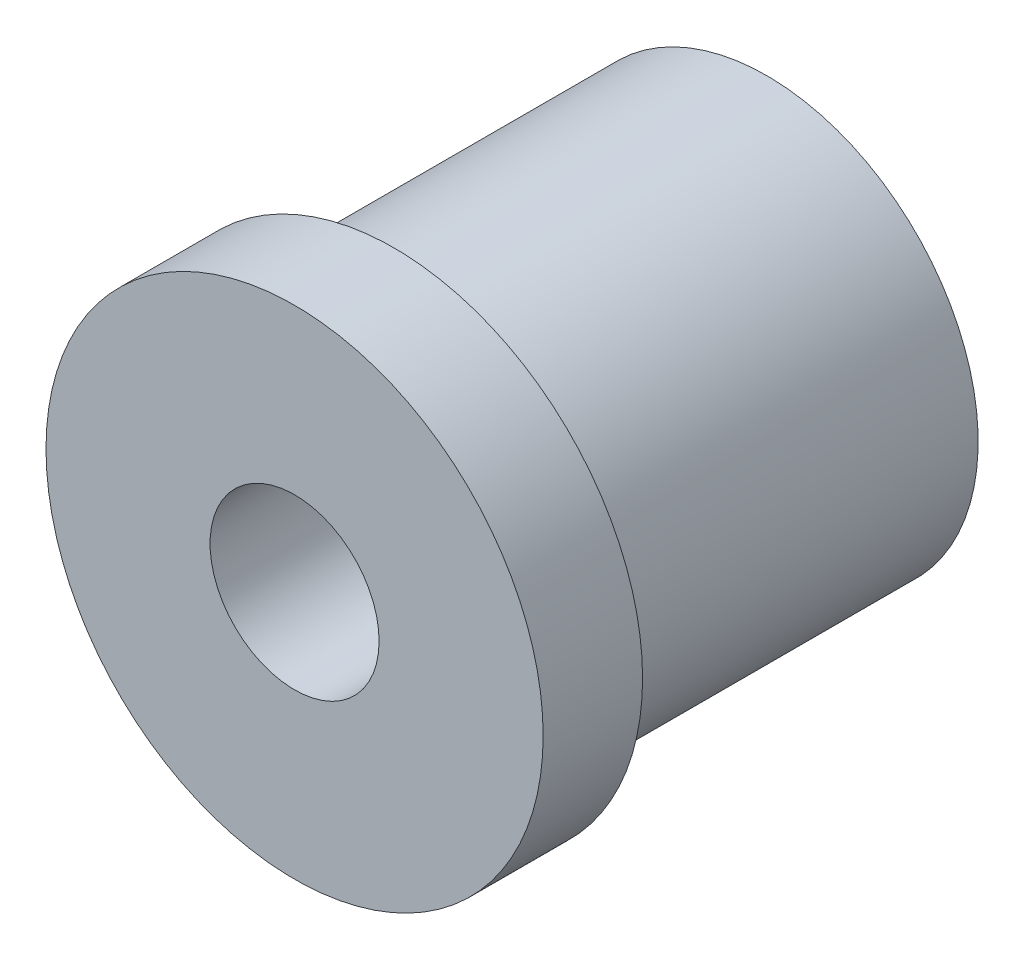
ISO-10303-21;
HEADER;
FILE_DESCRIPTION(('STEP AP214'),'2;1');
FILE_NAME('part.step','',(''),(''),'','','');
FILE_SCHEMA(('AUTOMOTIVE_DESIGN { 1 0 10303 214 1 1 1 1 }'));
ENDSEC;
DATA;
#1=APPLICATION_CONTEXT('core data for automotive mechanical design processes');
#2=APPLICATION_PROTOCOL_DEFINITION('international standard','automotive_design',2000,#1);
#3=PRODUCT_CONTEXT('',#1,'mechanical');
#4=PRODUCT('Part','Part','',(#3));
#5=PRODUCT_RELATED_PRODUCT_CATEGORY('part','',(#4));
#6=PRODUCT_DEFINITION_FORMATION('','',#4);
#7=PRODUCT_DEFINITION_CONTEXT('part definition',#1,'design');
#8=PRODUCT_DEFINITION('design','',#6,#7);
#9=PRODUCT_DEFINITION_SHAPE('','',#8);
#10=(LENGTH_UNIT() NAMED_UNIT(*) SI_UNIT(.MILLI.,.METRE.));
#11=(NAMED_UNIT(*) PLANE_ANGLE_UNIT() SI_UNIT($,.RADIAN.));
#12=(NAMED_UNIT(*) SI_UNIT($,.STERADIAN.) SOLID_ANGLE_UNIT());
#13=UNCERTAINTY_MEASURE_WITH_UNIT(LENGTH_MEASURE(1.E-05),#10,'distance_accuracy_value','');
#14=(GEOMETRIC_REPRESENTATION_CONTEXT(3) GLOBAL_UNCERTAINTY_ASSIGNED_CONTEXT((#13)) GLOBAL_UNIT_ASSIGNED_CONTEXT((#10,
#11,#12)) REPRESENTATION_CONTEXT('',''));
#15=CARTESIAN_POINT('',(0.,0.,0.));
#16=DIRECTION('',(0.,0.,1.));
#17=DIRECTION('',(1.,0.,0.));
#18=AXIS2_PLACEMENT_3D('',#15,#16,#17);
#19=CARTESIAN_POINT('',(0.,0.,4.));
#20=DIRECTION('',(0.,0.,-1.));
#21=DIRECTION('',(-1.,0.,0.));
#22=AXIS2_PLACEMENT_3D('',#19,#20,#21);
#23=CYLINDRICAL_SURFACE('',#22,10.);
#24=CARTESIAN_POINT('',(0.,0.,4.));
#25=DIRECTION('',(0.,0.,1.));
#26=DIRECTION('',(1.,0.,0.));
#27=AXIS2_PLACEMENT_3D('',#24,#25,#26);
#28=CIRCLE('',#27,10.);
#29=CARTESIAN_POINT('',(10.,0.,4.));
#30=VERTEX_POINT('',#29);
#31=EDGE_CURVE('E55',#30,#30,#28,.T.);
#32=ORIENTED_EDGE('',*,*,#31,.F.);
#33=EDGE_LOOP('',(#32));
#34=FACE_BOUND('',#33,.T.);
#35=CARTESIAN_POINT('',(0.,0.,0.));
#36=DIRECTION('',(0.,0.,1.));
#37=DIRECTION('',(1.,0.,0.));
#38=AXIS2_PLACEMENT_3D('',#35,#36,#37);
#39=CIRCLE('',#38,10.);
#40=CARTESIAN_POINT('',(10.,0.,0.));
#41=VERTEX_POINT('',#40);
#42=EDGE_CURVE('E50',#41,#41,#39,.T.);
#43=ORIENTED_EDGE('',*,*,#42,.T.);
#44=EDGE_LOOP('',(#43));
#45=FACE_BOUND('',#44,.T.);
#46=ADVANCED_FACE('F47',(#34,#45),#23,.T.);
#47=CARTESIAN_POINT('',(0.,0.,4.));
#48=DIRECTION('',(0.,0.,1.));
#49=DIRECTION('',(1.,0.,0.));
#50=AXIS2_PLACEMENT_3D('',#47,#48,#49);
#51=PLANE('',#50);
#52=CARTESIAN_POINT('',(0.,0.,4.));
#53=DIRECTION('',(0.,0.,1.));
#54=DIRECTION('',(1.,0.,0.));
#55=AXIS2_PLACEMENT_3D('',#52,#53,#54);
#56=CIRCLE('',#55,3.39999999999999);
#57=CARTESIAN_POINT('',(3.39999999999999,0.,4.));
#58=VERTEX_POINT('',#57);
#59=EDGE_CURVE('E70',#58,#58,#56,.T.);
#60=ORIENTED_EDGE('',*,*,#59,.F.);
#61=EDGE_LOOP('',(#60));
#62=FACE_BOUND('',#61,.T.);
#63=ORIENTED_EDGE('',*,*,#31,.T.);
#64=EDGE_LOOP('',(#63));
#65=FACE_BOUND('',#64,.T.);
#66=ADVANCED_FACE('F78',(#62,#65),#51,.T.);
#67=CARTESIAN_POINT('',(0.,0.,0.));
#68=DIRECTION('',(0.,0.,1.));
#69=DIRECTION('',(1.,0.,0.));
#70=AXIS2_PLACEMENT_3D('',#67,#68,#69);
#71=PLANE('',#70);
#72=CARTESIAN_POINT('',(0.,0.,0.));
#73=DIRECTION('',(0.,0.,-1.));
#74=DIRECTION('',(-1.,0.,0.));
#75=AXIS2_PLACEMENT_3D('',#72,#73,#74);
#76=CIRCLE('',#75,8.5);
#77=CARTESIAN_POINT('',(-8.5,0.,0.));
#78=VERTEX_POINT('',#77);
#79=EDGE_CURVE('E10',#78,#78,#76,.T.);
#80=ORIENTED_EDGE('',*,*,#79,.F.);
#81=EDGE_LOOP('',(#80));
#82=FACE_BOUND('',#81,.T.);
#83=ORIENTED_EDGE('',*,*,#42,.F.);
#84=EDGE_LOOP('',(#83));
#85=FACE_BOUND('',#84,.T.);
#86=ADVANCED_FACE('F81',(#82,#85),#71,.F.);
#87=CARTESIAN_POINT('',(0.,0.,-15.));
#88=DIRECTION('',(0.,0.,1.));
#89=DIRECTION('',(1.,0.,0.));
#90=AXIS2_PLACEMENT_3D('',#87,#88,#89);
#91=CYLINDRICAL_SURFACE('',#90,8.5);
#92=CARTESIAN_POINT('',(0.,0.,-15.));
#93=DIRECTION('',(0.,0.,-1.));
#94=DIRECTION('',(-1.,0.,0.));
#95=AXIS2_PLACEMENT_3D('',#92,#93,#94);
#96=CIRCLE('',#95,8.5);
#97=CARTESIAN_POINT('',(-8.5,0.,-15.));
#98=VERTEX_POINT('',#97);
#99=EDGE_CURVE('E62',#98,#98,#96,.T.);
#100=ORIENTED_EDGE('',*,*,#99,.F.);
#101=EDGE_LOOP('',(#100));
#102=FACE_BOUND('',#101,.T.);
#103=ORIENTED_EDGE('',*,*,#79,.T.);
#104=EDGE_LOOP('',(#103));
#105=FACE_BOUND('',#104,.T.);
#106=ADVANCED_FACE('F92',(#102,#105),#91,.T.);
#107=CARTESIAN_POINT('',(0.,0.,-15.));
#108=DIRECTION('',(0.,0.,-1.));
#109=DIRECTION('',(-1.,0.,0.));
#110=AXIS2_PLACEMENT_3D('',#107,#108,#109);
#111=PLANE('',#110);
#112=CARTESIAN_POINT('',(0.,0.,-15.));
#113=DIRECTION('',(0.,0.,-1.));
#114=DIRECTION('',(-1.,0.,0.));
#115=AXIS2_PLACEMENT_3D('',#112,#113,#114);
#116=CIRCLE('',#115,3.39999999999999);
#117=CARTESIAN_POINT('',(-3.39999999999999,0.,-15.));
#118=VERTEX_POINT('',#117);
#119=EDGE_CURVE('E66',#118,#118,#116,.T.);
#120=ORIENTED_EDGE('',*,*,#119,.F.);
#121=EDGE_LOOP('',(#120));
#122=FACE_BOUND('',#121,.T.);
#123=ORIENTED_EDGE('',*,*,#99,.T.);
#124=EDGE_LOOP('',(#123));
#125=FACE_BOUND('',#124,.T.);
#126=ADVANCED_FACE('F97',(#122,#125),#111,.T.);
#127=CARTESIAN_POINT('',(0.,0.,4.));
#128=DIRECTION('',(0.,0.,1.));
#129=DIRECTION('',(1.,0.,0.));
#130=AXIS2_PLACEMENT_3D('',#127,#128,#129);
#131=CYLINDRICAL_SURFACE('',#130,3.39999999999999);
#132=ORIENTED_EDGE('',*,*,#59,.T.);
#133=EDGE_LOOP('',(#132));
#134=FACE_BOUND('',#133,.T.);
#135=ORIENTED_EDGE('',*,*,#119,.T.);
#136=EDGE_LOOP('',(#135));
#137=FACE_BOUND('',#136,.T.);
#138=ADVANCED_FACE('F75',(#134,#137),#131,.F.);
#139=CLOSED_SHELL('',(#46,#66,#86,#106,#126,#138));
#140=MANIFOLD_SOLID_BREP('B2',#139);
#141=ADVANCED_BREP_SHAPE_REPRESENTATION('',(#18,#140),#14);
#142=SHAPE_DEFINITION_REPRESENTATION(#9,#141);
ENDSEC;
END-ISO-10303-21;
